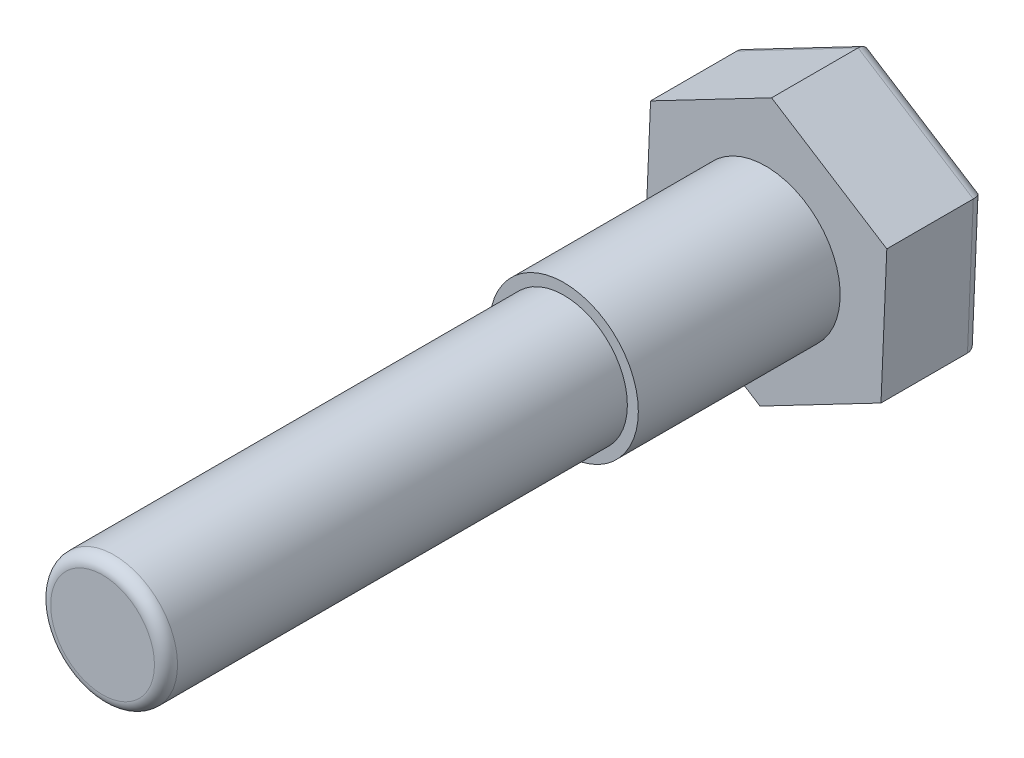
ISO-10303-21;
HEADER;
FILE_DESCRIPTION(('STEP AP214'),'2;1');
FILE_NAME('part.step','',(''),(''),'','','');
FILE_SCHEMA(('AUTOMOTIVE_DESIGN { 1 0 10303 214 1 1 1 1 }'));
ENDSEC;
DATA;
#1=APPLICATION_CONTEXT('core data for automotive mechanical design processes');
#2=APPLICATION_PROTOCOL_DEFINITION('international standard','automotive_design',2000,#1);
#3=PRODUCT_CONTEXT('',#1,'mechanical');
#4=PRODUCT('Part','Part','',(#3));
#5=PRODUCT_RELATED_PRODUCT_CATEGORY('part','',(#4));
#6=PRODUCT_DEFINITION_FORMATION('','',#4);
#7=PRODUCT_DEFINITION_CONTEXT('part definition',#1,'design');
#8=PRODUCT_DEFINITION('design','',#6,#7);
#9=PRODUCT_DEFINITION_SHAPE('','',#8);
#10=(LENGTH_UNIT() NAMED_UNIT(*) SI_UNIT(.MILLI.,.METRE.));
#11=(NAMED_UNIT(*) PLANE_ANGLE_UNIT() SI_UNIT($,.RADIAN.));
#12=(NAMED_UNIT(*) SI_UNIT($,.STERADIAN.) SOLID_ANGLE_UNIT());
#13=UNCERTAINTY_MEASURE_WITH_UNIT(LENGTH_MEASURE(1.E-05),#10,'distance_accuracy_value','');
#14=(GEOMETRIC_REPRESENTATION_CONTEXT(3) GLOBAL_UNCERTAINTY_ASSIGNED_CONTEXT((#13)) GLOBAL_UNIT_ASSIGNED_CONTEXT((#10,
#11,#12)) REPRESENTATION_CONTEXT('',''));
#15=CARTESIAN_POINT('',(0.,0.,0.));
#16=DIRECTION('',(0.,0.,1.));
#17=DIRECTION('',(1.,0.,0.));
#18=AXIS2_PLACEMENT_3D('',#15,#16,#17);
#19=CARTESIAN_POINT('',(0.,0.,52.));
#20=DIRECTION('',(0.,0.,1.));
#21=DIRECTION('',(1.,0.,0.));
#22=AXIS2_PLACEMENT_3D('',#19,#20,#21);
#23=PLANE('',#22);
#24=CARTESIAN_POINT('',(0.,0.,52.));
#25=DIRECTION('',(0.,0.,1.));
#26=DIRECTION('',(1.,0.,0.));
#27=AXIS2_PLACEMENT_3D('',#24,#25,#26);
#28=CIRCLE('',#27,12.9);
#29=CARTESIAN_POINT('',(12.9,0.,52.));
#30=VERTEX_POINT('',#29);
#31=EDGE_CURVE('E130',#30,#30,#28,.T.);
#32=ORIENTED_EDGE('',*,*,#31,.T.);
#33=EDGE_LOOP('',(#32));
#34=FACE_BOUND('',#33,.T.);
#35=CARTESIAN_POINT('',(0.,0.,52.));
#36=DIRECTION('',(0.,0.,1.));
#37=DIRECTION('',(1.,0.,0.));
#38=AXIS2_PLACEMENT_3D('',#35,#36,#37);
#39=CIRCLE('',#38,11.);
#40=CARTESIAN_POINT('',(11.,0.,52.));
#41=VERTEX_POINT('',#40);
#42=EDGE_CURVE('E168',#41,#41,#39,.T.);
#43=ORIENTED_EDGE('',*,*,#42,.F.);
#44=EDGE_LOOP('',(#43));
#45=FACE_BOUND('',#44,.T.);
#46=ADVANCED_FACE('F36',(#34,#45),#23,.T.);
#47=CARTESIAN_POINT('',(18.9733976863162,-36.3457037383633,17.));
#48=DIRECTION('',(0.,0.,-1.));
#49=DIRECTION('',(-1.,0.,0.));
#50=AXIS2_PLACEMENT_3D('',#47,#48,#49);
#51=PLANE('',#50);
#52=DIRECTION('',(0.0424733530909036,0.999097599975706,0.));
#53=VECTOR('',#52,1.);
#54=CARTESIAN_POINT('',(19.9787997617734,-12.6957037383635,17.));
#55=LINE('',#54,#53);
#56=CARTESIAN_POINT('',(19.9787997617734,-12.6957037383635,17.));
#57=VERTEX_POINT('',#56);
#58=CARTESIAN_POINT('',(20.9842018372306,10.9542962616365,17.));
#59=VERTEX_POINT('',#58);
#60=EDGE_CURVE('E122',#57,#59,#55,.T.);
#61=ORIENTED_EDGE('',*,*,#60,.T.);
#62=DIRECTION('',(-0.844007225893572,0.536331802748482,0.));
#63=VECTOR('',#62,1.);
#64=CARTESIAN_POINT('',(20.9842018372306,10.9542962616365,17.));
#65=LINE('',#64,#63);
#66=CARTESIAN_POINT('',(1.0054020754572,23.65,17.));
#67=VERTEX_POINT('',#66);
#68=EDGE_CURVE('E110',#59,#67,#65,.T.);
#69=ORIENTED_EDGE('',*,*,#68,.T.);
#70=DIRECTION('',(-0.886480578984472,-0.462765797227231,0.));
#71=VECTOR('',#70,1.);
#72=CARTESIAN_POINT('',(1.0054020754572,23.65,17.));
#73=LINE('',#72,#71);
#74=CARTESIAN_POINT('',(-19.9787997617736,12.6957037383632,17.));
#75=VERTEX_POINT('',#74);
#76=EDGE_CURVE('E121',#67,#75,#73,.T.);
#77=ORIENTED_EDGE('',*,*,#76,.T.);
#78=DIRECTION('',(-0.0424733530908878,-0.999097599975706,0.));
#79=VECTOR('',#78,1.);
#80=CARTESIAN_POINT('',(-19.9787997617736,12.6957037383632,17.));
#81=LINE('',#80,#79);
#82=CARTESIAN_POINT('',(-20.9842018372304,-10.9542962616368,17.));
#83=VERTEX_POINT('',#82);
#84=EDGE_CURVE('E272',#75,#83,#81,.T.);
#85=ORIENTED_EDGE('',*,*,#84,.T.);
#86=DIRECTION('',(0.844007225893576,-0.536331802748476,0.));
#87=VECTOR('',#86,1.);
#88=CARTESIAN_POINT('',(-20.9842018372304,-10.9542962616368,17.));
#89=LINE('',#88,#87);
#90=CARTESIAN_POINT('',(-1.00540207545719,-23.65,17.));
#91=VERTEX_POINT('',#90);
#92=EDGE_CURVE('E274',#83,#91,#89,.T.);
#93=ORIENTED_EDGE('',*,*,#92,.T.);
#94=DIRECTION('',(0.886480578984476,0.462765797227224,0.));
#95=VECTOR('',#94,1.);
#96=CARTESIAN_POINT('',(-1.00540207545719,-23.65,17.));
#97=LINE('',#96,#95);
#98=EDGE_CURVE('E128',#91,#57,#97,.T.);
#99=ORIENTED_EDGE('',*,*,#98,.T.);
#100=EDGE_LOOP('',(#61,#69,#77,#85,#93,#99));
#101=FACE_BOUND('',#100,.T.);
#102=CARTESIAN_POINT('',(0.,0.,17.));
#103=DIRECTION('',(0.,0.,-1.));
#104=DIRECTION('',(-1.,0.,0.));
#105=AXIS2_PLACEMENT_3D('',#102,#103,#104);
#106=CIRCLE('',#105,12.9);
#107=CARTESIAN_POINT('',(-12.9,0.,17.));
#108=VERTEX_POINT('',#107);
#109=EDGE_CURVE('E135',#108,#108,#106,.F.);
#110=ORIENTED_EDGE('',*,*,#109,.F.);
#111=EDGE_LOOP('',(#110));
#112=FACE_BOUND('',#111,.T.);
#113=ADVANCED_FACE('F125',(#101,#112),#51,.F.);
#114=CARTESIAN_POINT('',(19.9787997617734,-12.6957037383635,17.));
#115=DIRECTION('',(-0.999097599975706,0.0424733530909036,0.));
#116=DIRECTION('',(-0.0424733530909036,-0.999097599975706,0.));
#117=AXIS2_PLACEMENT_3D('',#114,#115,#116);
#118=PLANE('',#117);
#119=DIRECTION('',(0.,0.,-1.));
#120=VECTOR('',#119,1.);
#121=CARTESIAN_POINT('',(19.9787997617734,-12.6957037383635,17.));
#122=LINE('',#121,#120);
#123=CARTESIAN_POINT('',(19.9787997617734,-12.6957037383635,2.));
#124=VERTEX_POINT('',#123);
#125=EDGE_CURVE('E279',#57,#124,#122,.T.);
#126=ORIENTED_EDGE('',*,*,#125,.T.);
#127=DIRECTION('',(0.0424733530909036,0.999097599975706,0.));
#128=VECTOR('',#127,1.);
#129=CARTESIAN_POINT('',(20.9842018372306,10.9542962616365,2.));
#130=LINE('',#129,#128);
#131=CARTESIAN_POINT('',(20.9842018372306,10.9542962616365,2.));
#132=VERTEX_POINT('',#131);
#133=EDGE_CURVE('E134',#124,#132,#130,.T.);
#134=ORIENTED_EDGE('',*,*,#133,.T.);
#135=DIRECTION('',(0.,0.,-1.));
#136=VECTOR('',#135,1.);
#137=CARTESIAN_POINT('',(20.9842018372306,10.9542962616365,17.));
#138=LINE('',#137,#136);
#139=EDGE_CURVE('E115',#59,#132,#138,.T.);
#140=ORIENTED_EDGE('',*,*,#139,.F.);
#141=ORIENTED_EDGE('',*,*,#60,.F.);
#142=EDGE_LOOP('',(#126,#134,#140,#141));
#143=FACE_BOUND('',#142,.T.);
#144=ADVANCED_FACE('F132',(#143),#118,.F.);
#145=CARTESIAN_POINT('',(20.9842018372306,10.9542962616365,17.));
#146=DIRECTION('',(-0.536331802748482,-0.844007225893572,0.));
#147=DIRECTION('',(0.844007225893572,-0.536331802748482,0.));
#148=AXIS2_PLACEMENT_3D('',#145,#146,#147);
#149=PLANE('',#148);
#150=ORIENTED_EDGE('',*,*,#139,.T.);
#151=DIRECTION('',(-0.844007225893572,0.536331802748482,0.));
#152=VECTOR('',#151,1.);
#153=CARTESIAN_POINT('',(1.00540207545719,23.65,2.));
#154=LINE('',#153,#152);
#155=CARTESIAN_POINT('',(1.0054020754572,23.65,2.));
#156=VERTEX_POINT('',#155);
#157=EDGE_CURVE('E138',#132,#156,#154,.T.);
#158=ORIENTED_EDGE('',*,*,#157,.T.);
#159=DIRECTION('',(0.,0.,-1.));
#160=VECTOR('',#159,1.);
#161=CARTESIAN_POINT('',(1.0054020754572,23.65,17.));
#162=LINE('',#161,#160);
#163=EDGE_CURVE('E118',#67,#156,#162,.T.);
#164=ORIENTED_EDGE('',*,*,#163,.F.);
#165=ORIENTED_EDGE('',*,*,#68,.F.);
#166=EDGE_LOOP('',(#150,#158,#164,#165));
#167=FACE_BOUND('',#166,.T.);
#168=ADVANCED_FACE('F112',(#167),#149,.F.);
#169=CARTESIAN_POINT('',(1.0054020754572,23.65,17.));
#170=DIRECTION('',(0.462765797227231,-0.886480578984472,0.));
#171=DIRECTION('',(0.886480578984472,0.462765797227231,0.));
#172=AXIS2_PLACEMENT_3D('',#169,#170,#171);
#173=PLANE('',#172);
#174=ORIENTED_EDGE('',*,*,#163,.T.);
#175=DIRECTION('',(-0.886480578984472,-0.462765797227231,0.));
#176=VECTOR('',#175,1.);
#177=CARTESIAN_POINT('',(-19.9787997617736,12.6957037383632,2.));
#178=LINE('',#177,#176);
#179=CARTESIAN_POINT('',(-19.9787997617736,12.6957037383632,2.));
#180=VERTEX_POINT('',#179);
#181=EDGE_CURVE('E158',#156,#180,#178,.T.);
#182=ORIENTED_EDGE('',*,*,#181,.T.);
#183=DIRECTION('',(0.,0.,-1.));
#184=VECTOR('',#183,1.);
#185=CARTESIAN_POINT('',(-19.9787997617736,12.6957037383632,17.));
#186=LINE('',#185,#184);
#187=EDGE_CURVE('E140',#75,#180,#186,.T.);
#188=ORIENTED_EDGE('',*,*,#187,.F.);
#189=ORIENTED_EDGE('',*,*,#76,.F.);
#190=EDGE_LOOP('',(#174,#182,#188,#189));
#191=FACE_BOUND('',#190,.T.);
#192=ADVANCED_FACE('F223',(#191),#173,.F.);
#193=CARTESIAN_POINT('',(-19.9787997617736,12.6957037383632,17.));
#194=DIRECTION('',(0.999097599975706,-0.0424733530908878,0.));
#195=DIRECTION('',(0.0424733530908878,0.999097599975707,0.));
#196=AXIS2_PLACEMENT_3D('',#193,#194,#195);
#197=PLANE('',#196);
#198=ORIENTED_EDGE('',*,*,#187,.T.);
#199=DIRECTION('',(-0.0424733530908878,-0.999097599975707,0.));
#200=VECTOR('',#199,1.);
#201=CARTESIAN_POINT('',(-20.9842018372304,-10.9542962616368,2.));
#202=LINE('',#201,#200);
#203=CARTESIAN_POINT('',(-20.9842018372304,-10.9542962616368,2.));
#204=VERTEX_POINT('',#203);
#205=EDGE_CURVE('E160',#180,#204,#202,.T.);
#206=ORIENTED_EDGE('',*,*,#205,.T.);
#207=DIRECTION('',(0.,0.,-1.));
#208=VECTOR('',#207,1.);
#209=CARTESIAN_POINT('',(-20.9842018372304,-10.9542962616368,17.));
#210=LINE('',#209,#208);
#211=EDGE_CURVE('E283',#83,#204,#210,.T.);
#212=ORIENTED_EDGE('',*,*,#211,.F.);
#213=ORIENTED_EDGE('',*,*,#84,.F.);
#214=EDGE_LOOP('',(#198,#206,#212,#213));
#215=FACE_BOUND('',#214,.T.);
#216=ADVANCED_FACE('F220',(#215),#197,.F.);
#217=CARTESIAN_POINT('',(-20.9842018372304,-10.9542962616368,17.));
#218=DIRECTION('',(0.536331802748476,0.844007225893576,0.));
#219=DIRECTION('',(-0.844007225893576,0.536331802748476,0.));
#220=AXIS2_PLACEMENT_3D('',#217,#218,#219);
#221=PLANE('',#220);
#222=ORIENTED_EDGE('',*,*,#211,.T.);
#223=DIRECTION('',(0.844007225893576,-0.536331802748476,0.));
#224=VECTOR('',#223,1.);
#225=CARTESIAN_POINT('',(-1.00540207545719,-23.65,2.));
#226=LINE('',#225,#224);
#227=CARTESIAN_POINT('',(-1.00540207545719,-23.65,2.));
#228=VERTEX_POINT('',#227);
#229=EDGE_CURVE('E59',#204,#228,#226,.T.);
#230=ORIENTED_EDGE('',*,*,#229,.T.);
#231=DIRECTION('',(0.,0.,-1.));
#232=VECTOR('',#231,1.);
#233=CARTESIAN_POINT('',(-1.00540207545719,-23.65,17.));
#234=LINE('',#233,#232);
#235=EDGE_CURVE('E281',#91,#228,#234,.T.);
#236=ORIENTED_EDGE('',*,*,#235,.F.);
#237=ORIENTED_EDGE('',*,*,#92,.F.);
#238=EDGE_LOOP('',(#222,#230,#236,#237));
#239=FACE_BOUND('',#238,.T.);
#240=ADVANCED_FACE('F217',(#239),#221,.F.);
#241=CARTESIAN_POINT('',(-1.00540207545719,-23.65,17.));
#242=DIRECTION('',(-0.462765797227224,0.886480578984476,0.));
#243=DIRECTION('',(-0.886480578984476,-0.462765797227224,0.));
#244=AXIS2_PLACEMENT_3D('',#241,#242,#243);
#245=PLANE('',#244);
#246=ORIENTED_EDGE('',*,*,#235,.T.);
#247=DIRECTION('',(0.886480578984476,0.462765797227224,0.));
#248=VECTOR('',#247,1.);
#249=CARTESIAN_POINT('',(19.9787997617734,-12.6957037383635,2.));
#250=LINE('',#249,#248);
#251=EDGE_CURVE('E51',#228,#124,#250,.T.);
#252=ORIENTED_EDGE('',*,*,#251,.T.);
#253=ORIENTED_EDGE('',*,*,#125,.F.);
#254=ORIENTED_EDGE('',*,*,#98,.F.);
#255=EDGE_LOOP('',(#246,#252,#253,#254));
#256=FACE_BOUND('',#255,.T.);
#257=ADVANCED_FACE('F213',(#256),#245,.F.);
#258=CARTESIAN_POINT('',(18.9733976863162,-36.3457037383633,0.));
#259=DIRECTION('',(0.,0.,-1.));
#260=DIRECTION('',(-1.,0.,0.));
#261=AXIS2_PLACEMENT_3D('',#258,#259,#260);
#262=PLANE('',#261);
#263=DIRECTION('',(-0.886480578984472,-0.462765797227231,0.));
#264=VECTOR('',#263,1.);
#265=CARTESIAN_POINT('',(1.93093366991166,21.8770388420311,0.));
#266=LINE('',#265,#264);
#267=CARTESIAN_POINT('',(-18.029648565503,11.4570984955961,0.));
#268=VERTEX_POINT('',#267);
#269=CARTESIAN_POINT('',(0.907314068095531,21.3426829268293,0.));
#270=VERTEX_POINT('',#269);
#271=EDGE_CURVE('E153',#268,#270,#266,.F.);
#272=ORIENTED_EDGE('',*,*,#271,.T.);
#273=DIRECTION('',(-0.844007225893572,0.536331802748482,0.));
#274=VECTOR('',#273,1.);
#275=CARTESIAN_POINT('',(19.9115382317336,9.26628180984933,0.));
#276=LINE('',#275,#274);
#277=CARTESIAN_POINT('',(18.9369626335983,9.88558443123292,0.));
#278=VERTEX_POINT('',#277);
#279=EDGE_CURVE('E155',#270,#278,#276,.F.);
#280=ORIENTED_EDGE('',*,*,#279,.T.);
#281=DIRECTION('',(0.0424733530909036,0.999097599975706,0.));
#282=VECTOR('',#281,1.);
#283=CARTESIAN_POINT('',(17.980604561822,-12.6107570321817,0.));
#284=LINE('',#283,#282);
#285=CARTESIAN_POINT('',(18.0296485655028,-11.4570984955964,0.));
#286=VERTEX_POINT('',#285);
#287=EDGE_CURVE('E145',#278,#286,#284,.F.);
#288=ORIENTED_EDGE('',*,*,#287,.T.);
#289=DIRECTION('',(0.886480578984476,0.462765797227224,0.));
#290=VECTOR('',#289,1.);
#291=CARTESIAN_POINT('',(-1.93093366991164,-21.877038842031,0.));
#292=LINE('',#291,#290);
#293=CARTESIAN_POINT('',(-0.90731406809552,-21.3426829268293,0.));
#294=VERTEX_POINT('',#293);
#295=EDGE_CURVE('E147',#286,#294,#292,.F.);
#296=ORIENTED_EDGE('',*,*,#295,.T.);
#297=DIRECTION('',(0.844007225893576,-0.536331802748476,0.));
#298=VECTOR('',#297,1.);
#299=CARTESIAN_POINT('',(-19.9115382317334,-9.26628180984964,0.));
#300=LINE('',#299,#298);
#301=CARTESIAN_POINT('',(-18.9369626335981,-9.88558443123322,0.));
#302=VERTEX_POINT('',#301);
#303=EDGE_CURVE('E149',#294,#302,#300,.F.);
#304=ORIENTED_EDGE('',*,*,#303,.T.);
#305=DIRECTION('',(-0.0424733530908878,-0.999097599975707,0.));
#306=VECTOR('',#305,1.);
#307=CARTESIAN_POINT('',(-17.9806045618221,12.6107570321814,0.));
#308=LINE('',#307,#306);
#309=EDGE_CURVE('E151',#302,#268,#308,.F.);
#310=ORIENTED_EDGE('',*,*,#309,.T.);
#311=EDGE_LOOP('',(#272,#280,#288,#296,#304,#310));
#312=FACE_BOUND('',#311,.T.);
#313=ADVANCED_FACE('F208',(#312),#262,.T.);
#314=CARTESIAN_POINT('',(0.,0.,52.));
#315=DIRECTION('',(0.,0.,-1.));
#316=DIRECTION('',(-1.,0.,0.));
#317=AXIS2_PLACEMENT_3D('',#314,#315,#316);
#318=CYLINDRICAL_SURFACE('',#317,12.9);
#319=ORIENTED_EDGE('',*,*,#31,.F.);
#320=EDGE_LOOP('',(#319));
#321=FACE_BOUND('',#320,.T.);
#322=ORIENTED_EDGE('',*,*,#109,.T.);
#323=EDGE_LOOP('',(#322));
#324=FACE_BOUND('',#323,.T.);
#325=ADVANCED_FACE('F205',(#321,#324),#318,.T.);
#326=CARTESIAN_POINT('',(-19.9115382317334,-9.26628180984964,2.));
#327=DIRECTION('',(-0.844007225893576,0.536331802748476,0.));
#328=DIRECTION('',(-0.536331802748476,-0.844007225893576,0.));
#329=AXIS2_PLACEMENT_3D('',#326,#327,#328);
#330=CYLINDRICAL_SURFACE('',#329,2.);
#331=CARTESIAN_POINT('',(-18.9369626335981,-9.88558443123322,2.));
#332=DIRECTION('',(-0.462765797227234,0.886480578984471,0.));
#333=DIRECTION('',(-0.886480578984471,-0.462765797227234,0.));
#334=AXIS2_PLACEMENT_3D('',#331,#332,#333);
#335=ELLIPSE('',#334,2.3094010767585,2.);
#336=EDGE_CURVE('E176',#302,#204,#335,.T.);
#337=ORIENTED_EDGE('',*,*,#336,.F.);
#338=ORIENTED_EDGE('',*,*,#303,.F.);
#339=CARTESIAN_POINT('',(-0.90731406809552,-21.3426829268293,2.));
#340=DIRECTION('',(-0.999097599975706,0.0424733530909003,0.));
#341=DIRECTION('',(-0.0424733530909002,-0.999097599975706,0.));
#342=AXIS2_PLACEMENT_3D('',#339,#340,#341);
#343=ELLIPSE('',#342,2.3094010767585,2.);
#344=EDGE_CURVE('E179',#228,#294,#343,.F.);
#345=ORIENTED_EDGE('',*,*,#344,.F.);
#346=ORIENTED_EDGE('',*,*,#229,.F.);
#347=EDGE_LOOP('',(#337,#338,#345,#346));
#348=FACE_BOUND('',#347,.T.);
#349=ADVANCED_FACE('F207',(#348),#330,.T.);
#350=CARTESIAN_POINT('',(-1.93093366991164,-21.877038842031,2.));
#351=DIRECTION('',(-0.886480578984476,-0.462765797227224,0.));
#352=DIRECTION('',(0.462765797227224,-0.886480578984476,0.));
#353=AXIS2_PLACEMENT_3D('',#350,#351,#352);
#354=CYLINDRICAL_SURFACE('',#353,2.);
#355=ORIENTED_EDGE('',*,*,#344,.T.);
#356=ORIENTED_EDGE('',*,*,#295,.F.);
#357=CARTESIAN_POINT('',(18.0296485655028,-11.4570984955964,2.));
#358=DIRECTION('',(-0.536331802748482,-0.844007225893572,0.));
#359=DIRECTION('',(0.844007225893572,-0.536331802748482,0.));
#360=AXIS2_PLACEMENT_3D('',#357,#358,#359);
#361=ELLIPSE('',#360,2.3094010767585,2.);
#362=EDGE_CURVE('E173',#124,#286,#361,.F.);
#363=ORIENTED_EDGE('',*,*,#362,.F.);
#364=ORIENTED_EDGE('',*,*,#251,.F.);
#365=EDGE_LOOP('',(#355,#356,#363,#364));
#366=FACE_BOUND('',#365,.T.);
#367=ADVANCED_FACE('F247',(#366),#354,.T.);
#368=CARTESIAN_POINT('',(-17.9806045618221,12.6107570321814,2.));
#369=DIRECTION('',(0.0424733530908878,0.999097599975707,0.));
#370=DIRECTION('',(-0.999097599975707,0.0424733530908878,0.));
#371=AXIS2_PLACEMENT_3D('',#368,#369,#370);
#372=CYLINDRICAL_SURFACE('',#371,2.);
#373=ORIENTED_EDGE('',*,*,#336,.T.);
#374=ORIENTED_EDGE('',*,*,#205,.F.);
#375=CARTESIAN_POINT('',(-18.029648565503,11.457098495596,2.));
#376=DIRECTION('',(0.536331802748472,0.844007225893579,0.));
#377=DIRECTION('',(-0.844007225893579,0.536331802748472,0.));
#378=AXIS2_PLACEMENT_3D('',#375,#376,#377);
#379=ELLIPSE('',#378,2.30940107675851,2.);
#380=EDGE_CURVE('E170',#268,#180,#379,.T.);
#381=ORIENTED_EDGE('',*,*,#380,.F.);
#382=ORIENTED_EDGE('',*,*,#309,.F.);
#383=EDGE_LOOP('',(#373,#374,#381,#382));
#384=FACE_BOUND('',#383,.T.);
#385=ADVANCED_FACE('F243',(#384),#372,.T.);
#386=CARTESIAN_POINT('',(17.980604561822,-12.6107570321817,2.));
#387=DIRECTION('',(-0.0424733530909036,-0.999097599975706,0.));
#388=DIRECTION('',(0.999097599975706,-0.0424733530909036,0.));
#389=AXIS2_PLACEMENT_3D('',#386,#387,#388);
#390=CYLINDRICAL_SURFACE('',#389,2.);
#391=ORIENTED_EDGE('',*,*,#362,.T.);
#392=ORIENTED_EDGE('',*,*,#287,.F.);
#393=CARTESIAN_POINT('',(18.9369626335983,9.88558443123291,2.));
#394=DIRECTION('',(0.462765797227224,-0.886480578984476,0.));
#395=DIRECTION('',(-0.886480578984476,-0.462765797227224,0.));
#396=AXIS2_PLACEMENT_3D('',#393,#394,#395);
#397=ELLIPSE('',#396,2.3094010767585,2.);
#398=EDGE_CURVE('E167',#132,#278,#397,.F.);
#399=ORIENTED_EDGE('',*,*,#398,.F.);
#400=ORIENTED_EDGE('',*,*,#133,.F.);
#401=EDGE_LOOP('',(#391,#392,#399,#400));
#402=FACE_BOUND('',#401,.T.);
#403=ADVANCED_FACE('F239',(#402),#390,.T.);
#404=CARTESIAN_POINT('',(1.93093366991166,21.8770388420311,2.));
#405=DIRECTION('',(0.886480578984472,0.462765797227231,0.));
#406=DIRECTION('',(-0.462765797227231,0.886480578984472,0.));
#407=AXIS2_PLACEMENT_3D('',#404,#405,#406);
#408=CYLINDRICAL_SURFACE('',#407,2.);
#409=ORIENTED_EDGE('',*,*,#380,.T.);
#410=ORIENTED_EDGE('',*,*,#181,.F.);
#411=CARTESIAN_POINT('',(0.907314068095525,21.3426829268293,2.));
#412=DIRECTION('',(0.999097599975706,-0.0424733530908997,0.));
#413=DIRECTION('',(0.0424733530908995,0.999097599975706,0.));
#414=AXIS2_PLACEMENT_3D('',#411,#412,#413);
#415=ELLIPSE('',#414,2.30940107675851,2.);
#416=EDGE_CURVE('E165',#270,#156,#415,.T.);
#417=ORIENTED_EDGE('',*,*,#416,.F.);
#418=ORIENTED_EDGE('',*,*,#271,.F.);
#419=EDGE_LOOP('',(#409,#410,#417,#418));
#420=FACE_BOUND('',#419,.T.);
#421=ADVANCED_FACE('F235',(#420),#408,.T.);
#422=CARTESIAN_POINT('',(19.9115382317336,9.26628180984933,2.));
#423=DIRECTION('',(0.844007225893572,-0.536331802748482,0.));
#424=DIRECTION('',(0.536331802748482,0.844007225893572,0.));
#425=AXIS2_PLACEMENT_3D('',#422,#423,#424);
#426=CYLINDRICAL_SURFACE('',#425,2.);
#427=ORIENTED_EDGE('',*,*,#398,.T.);
#428=ORIENTED_EDGE('',*,*,#279,.F.);
#429=ORIENTED_EDGE('',*,*,#416,.T.);
#430=ORIENTED_EDGE('',*,*,#157,.F.);
#431=EDGE_LOOP('',(#427,#428,#429,#430));
#432=FACE_BOUND('',#431,.T.);
#433=ADVANCED_FACE('F232',(#432),#426,.T.);
#434=CARTESIAN_POINT('',(0.,0.,132.));
#435=DIRECTION('',(0.,0.,-1.));
#436=DIRECTION('',(-1.,0.,0.));
#437=AXIS2_PLACEMENT_3D('',#434,#435,#436);
#438=CYLINDRICAL_SURFACE('',#437,11.);
#439=CARTESIAN_POINT('',(0.,0.,130.));
#440=DIRECTION('',(0.,0.,1.));
#441=DIRECTION('',(1.,0.,0.));
#442=AXIS2_PLACEMENT_3D('',#439,#440,#441);
#443=CIRCLE('',#442,11.);
#444=CARTESIAN_POINT('',(11.,0.,130.));
#445=VERTEX_POINT('',#444);
#446=EDGE_CURVE('E11',#445,#445,#443,.F.);
#447=ORIENTED_EDGE('',*,*,#446,.T.);
#448=EDGE_LOOP('',(#447));
#449=FACE_BOUND('',#448,.T.);
#450=ORIENTED_EDGE('',*,*,#42,.T.);
#451=EDGE_LOOP('',(#450));
#452=FACE_BOUND('',#451,.T.);
#453=ADVANCED_FACE('F191',(#449,#452),#438,.T.);
#454=CARTESIAN_POINT('',(0.,0.,132.));
#455=DIRECTION('',(0.,0.,1.));
#456=DIRECTION('',(1.,0.,0.));
#457=AXIS2_PLACEMENT_3D('',#454,#455,#456);
#458=PLANE('',#457);
#459=CARTESIAN_POINT('',(0.,0.,132.));
#460=DIRECTION('',(0.,0.,1.));
#461=DIRECTION('',(1.,0.,0.));
#462=AXIS2_PLACEMENT_3D('',#459,#460,#461);
#463=CIRCLE('',#462,9.);
#464=CARTESIAN_POINT('',(9.,0.,132.));
#465=VERTEX_POINT('',#464);
#466=EDGE_CURVE('E44',#465,#465,#463,.T.);
#467=ORIENTED_EDGE('',*,*,#466,.T.);
#468=EDGE_LOOP('',(#467));
#469=FACE_BOUND('',#468,.T.);
#470=ADVANCED_FACE('F184',(#469),#458,.T.);
#471=CARTESIAN_POINT('',(0.,0.,130.));
#472=DIRECTION('',(0.,0.,1.));
#473=DIRECTION('',(1.,0.,0.));
#474=AXIS2_PLACEMENT_3D('',#471,#472,#473);
#475=TOROIDAL_SURFACE('',#474,9.,2.);
#476=ORIENTED_EDGE('',*,*,#446,.F.);
#477=EDGE_LOOP('',(#476));
#478=FACE_BOUND('',#477,.T.);
#479=ORIENTED_EDGE('',*,*,#466,.F.);
#480=EDGE_LOOP('',(#479));
#481=FACE_BOUND('',#480,.T.);
#482=ADVANCED_FACE('F38',(#478,#481),#475,.T.);
#483=CLOSED_SHELL('',(#46,#113,#144,#168,#192,#216,#240,#257,#313,#325,#349,#367,#385,#403,#421,
#433,#453,#470,#482));
#484=MANIFOLD_SOLID_BREP('B2',#483);
#485=ADVANCED_BREP_SHAPE_REPRESENTATION('',(#18,#484),#14);
#486=SHAPE_DEFINITION_REPRESENTATION(#9,#485);
ENDSEC;
END-ISO-10303-21;
